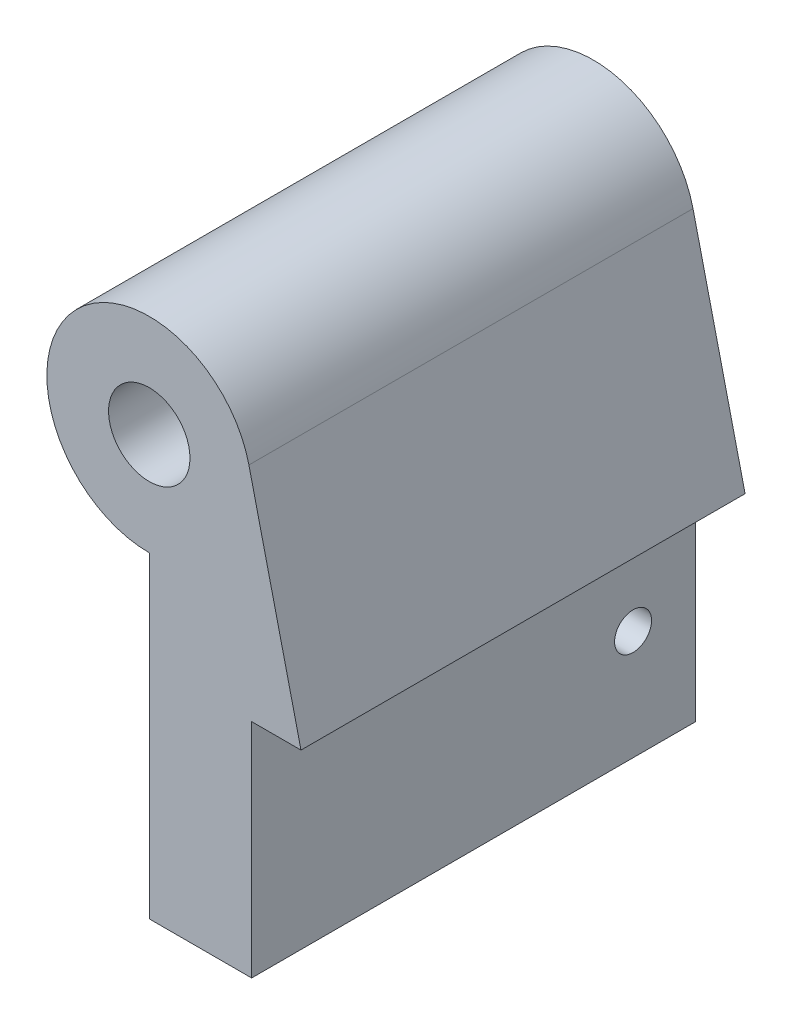
ISO-10303-21;
HEADER;
FILE_DESCRIPTION(('STEP AP214'),'2;1');
FILE_NAME('part.step','',(''),(''),'','','');
FILE_SCHEMA(('AUTOMOTIVE_DESIGN { 1 0 10303 214 1 1 1 1 }'));
ENDSEC;
DATA;
#1=APPLICATION_CONTEXT('core data for automotive mechanical design processes');
#2=APPLICATION_PROTOCOL_DEFINITION('international standard','automotive_design',2000,#1);
#3=PRODUCT_CONTEXT('',#1,'mechanical');
#4=PRODUCT('Part','Part','',(#3));
#5=PRODUCT_RELATED_PRODUCT_CATEGORY('part','',(#4));
#6=PRODUCT_DEFINITION_FORMATION('','',#4);
#7=PRODUCT_DEFINITION_CONTEXT('part definition',#1,'design');
#8=PRODUCT_DEFINITION('design','',#6,#7);
#9=PRODUCT_DEFINITION_SHAPE('','',#8);
#10=(LENGTH_UNIT() NAMED_UNIT(*) SI_UNIT(.MILLI.,.METRE.));
#11=(NAMED_UNIT(*) PLANE_ANGLE_UNIT() SI_UNIT($,.RADIAN.));
#12=(NAMED_UNIT(*) SI_UNIT($,.STERADIAN.) SOLID_ANGLE_UNIT());
#13=UNCERTAINTY_MEASURE_WITH_UNIT(LENGTH_MEASURE(1.E-05),#10,'distance_accuracy_value','');
#14=(GEOMETRIC_REPRESENTATION_CONTEXT(3) GLOBAL_UNCERTAINTY_ASSIGNED_CONTEXT((#13)) GLOBAL_UNIT_ASSIGNED_CONTEXT((#10,
#11,#12)) REPRESENTATION_CONTEXT('',''));
#15=CARTESIAN_POINT('',(0.,0.,0.));
#16=DIRECTION('',(0.,0.,1.));
#17=DIRECTION('',(1.,0.,0.));
#18=AXIS2_PLACEMENT_3D('',#15,#16,#17);
#19=CARTESIAN_POINT('',(0.,0.,9.));
#20=DIRECTION('',(0.,0.,1.));
#21=DIRECTION('',(1.,0.,0.));
#22=AXIS2_PLACEMENT_3D('',#19,#20,#21);
#23=PLANE('',#22);
#24=DIRECTION('',(1.,0.,0.));
#25=VECTOR('',#24,1.);
#26=CARTESIAN_POINT('',(4.15,-8.,9.));
#27=LINE('',#26,#25);
#28=CARTESIAN_POINT('',(4.15,-8.,9.));
#29=VERTEX_POINT('',#28);
#30=CARTESIAN_POINT('',(6.15,-8.,9.));
#31=VERTEX_POINT('',#30);
#32=EDGE_CURVE('E129',#29,#31,#27,.T.);
#33=ORIENTED_EDGE('',*,*,#32,.T.);
#34=DIRECTION('',(-0.229483943674819,0.973312447056675,0.));
#35=VECTOR('',#34,1.);
#36=CARTESIAN_POINT('',(6.15,-8.,9.));
#37=LINE('',#36,#35);
#38=CARTESIAN_POINT('',(4.0392466552852,0.952358366250499,9.));
#39=VERTEX_POINT('',#38);
#40=EDGE_CURVE('E87',#31,#39,#37,.T.);
#41=ORIENTED_EDGE('',*,*,#40,.T.);
#42=CARTESIAN_POINT('',(0.,0.,9.));
#43=DIRECTION('',(0.,0.,1.));
#44=DIRECTION('',(1.,0.,0.));
#45=AXIS2_PLACEMENT_3D('',#42,#43,#44);
#46=CIRCLE('',#45,4.15);
#47=CARTESIAN_POINT('',(0.,-4.15,9.));
#48=VERTEX_POINT('',#47);
#49=EDGE_CURVE('E100',#39,#48,#46,.T.);
#50=ORIENTED_EDGE('',*,*,#49,.T.);
#51=DIRECTION('',(0.,-1.,0.));
#52=VECTOR('',#51,1.);
#53=CARTESIAN_POINT('',(0.,-4.15,9.));
#54=LINE('',#53,#52);
#55=CARTESIAN_POINT('',(0.,-17.,9.));
#56=VERTEX_POINT('',#55);
#57=EDGE_CURVE('E94',#48,#56,#54,.T.);
#58=ORIENTED_EDGE('',*,*,#57,.T.);
#59=DIRECTION('',(1.,0.,0.));
#60=VECTOR('',#59,1.);
#61=CARTESIAN_POINT('',(0.,-17.,9.));
#62=LINE('',#61,#60);
#63=CARTESIAN_POINT('',(4.15,-17.,9.));
#64=VERTEX_POINT('',#63);
#65=EDGE_CURVE('E98',#56,#64,#62,.T.);
#66=ORIENTED_EDGE('',*,*,#65,.T.);
#67=DIRECTION('',(0.,1.,0.));
#68=VECTOR('',#67,1.);
#69=CARTESIAN_POINT('',(4.15,-17.,9.));
#70=LINE('',#69,#68);
#71=EDGE_CURVE('E50',#64,#29,#70,.T.);
#72=ORIENTED_EDGE('',*,*,#71,.T.);
#73=EDGE_LOOP('',(#33,#41,#50,#58,#66,#72));
#74=FACE_BOUND('',#73,.T.);
#75=CARTESIAN_POINT('',(0.,0.,9.));
#76=DIRECTION('',(0.,0.,1.));
#77=DIRECTION('',(1.,0.,0.));
#78=AXIS2_PLACEMENT_3D('',#75,#76,#77);
#79=CIRCLE('',#78,1.65);
#80=CARTESIAN_POINT('',(1.65,0.,9.));
#81=VERTEX_POINT('',#80);
#82=EDGE_CURVE('E122',#81,#81,#79,.T.);
#83=ORIENTED_EDGE('',*,*,#82,.F.);
#84=EDGE_LOOP('',(#83));
#85=FACE_BOUND('',#84,.T.);
#86=ADVANCED_FACE('F33',(#74,#85),#23,.T.);
#87=CARTESIAN_POINT('',(0.,0.,-9.));
#88=DIRECTION('',(0.,0.,1.));
#89=DIRECTION('',(1.,0.,0.));
#90=AXIS2_PLACEMENT_3D('',#87,#88,#89);
#91=PLANE('',#90);
#92=DIRECTION('',(1.,0.,0.));
#93=VECTOR('',#92,1.);
#94=CARTESIAN_POINT('',(4.15,-8.,-9.));
#95=LINE('',#94,#93);
#96=CARTESIAN_POINT('',(4.15,-8.,-9.));
#97=VERTEX_POINT('',#96);
#98=CARTESIAN_POINT('',(6.15,-8.,-9.));
#99=VERTEX_POINT('',#98);
#100=EDGE_CURVE('E118',#97,#99,#95,.T.);
#101=ORIENTED_EDGE('',*,*,#100,.F.);
#102=DIRECTION('',(0.,1.,0.));
#103=VECTOR('',#102,1.);
#104=CARTESIAN_POINT('',(4.15,-17.,-9.));
#105=LINE('',#104,#103);
#106=CARTESIAN_POINT('',(4.15,-17.,-9.));
#107=VERTEX_POINT('',#106);
#108=EDGE_CURVE('E79',#107,#97,#105,.T.);
#109=ORIENTED_EDGE('',*,*,#108,.F.);
#110=DIRECTION('',(1.,0.,0.));
#111=VECTOR('',#110,1.);
#112=CARTESIAN_POINT('',(0.,-17.,-9.));
#113=LINE('',#112,#111);
#114=CARTESIAN_POINT('',(0.,-17.,-9.));
#115=VERTEX_POINT('',#114);
#116=EDGE_CURVE('E73',#115,#107,#113,.T.);
#117=ORIENTED_EDGE('',*,*,#116,.F.);
#118=DIRECTION('',(0.,-1.,0.));
#119=VECTOR('',#118,1.);
#120=CARTESIAN_POINT('',(0.,-4.15,-9.));
#121=LINE('',#120,#119);
#122=CARTESIAN_POINT('',(0.,-4.15,-9.));
#123=VERTEX_POINT('',#122);
#124=EDGE_CURVE('E108',#123,#115,#121,.T.);
#125=ORIENTED_EDGE('',*,*,#124,.F.);
#126=CARTESIAN_POINT('',(0.,0.,-9.));
#127=DIRECTION('',(0.,0.,1.));
#128=DIRECTION('',(1.,0.,0.));
#129=AXIS2_PLACEMENT_3D('',#126,#127,#128);
#130=CIRCLE('',#129,4.15);
#131=CARTESIAN_POINT('',(4.0392466552852,0.952358366250499,-9.));
#132=VERTEX_POINT('',#131);
#133=EDGE_CURVE('E124',#132,#123,#130,.T.);
#134=ORIENTED_EDGE('',*,*,#133,.F.);
#135=DIRECTION('',(-0.229483943674819,0.973312447056675,0.));
#136=VECTOR('',#135,1.);
#137=CARTESIAN_POINT('',(6.15,-8.,-9.));
#138=LINE('',#137,#136);
#139=EDGE_CURVE('E121',#99,#132,#138,.T.);
#140=ORIENTED_EDGE('',*,*,#139,.F.);
#141=EDGE_LOOP('',(#101,#109,#117,#125,#134,#140));
#142=FACE_BOUND('',#141,.T.);
#143=CARTESIAN_POINT('',(0.,0.,-9.));
#144=DIRECTION('',(0.,0.,1.));
#145=DIRECTION('',(1.,0.,0.));
#146=AXIS2_PLACEMENT_3D('',#143,#144,#145);
#147=CIRCLE('',#146,1.65);
#148=CARTESIAN_POINT('',(1.65,0.,-9.));
#149=VERTEX_POINT('',#148);
#150=EDGE_CURVE('E175',#149,#149,#147,.T.);
#151=ORIENTED_EDGE('',*,*,#150,.T.);
#152=EDGE_LOOP('',(#151));
#153=FACE_BOUND('',#152,.T.);
#154=ADVANCED_FACE('F138',(#142,#153),#91,.F.);
#155=CARTESIAN_POINT('',(4.15,-8.,9.));
#156=DIRECTION('',(0.,1.,0.));
#157=DIRECTION('',(0.,0.,1.));
#158=AXIS2_PLACEMENT_3D('',#155,#156,#157);
#159=PLANE('',#158);
#160=ORIENTED_EDGE('',*,*,#100,.T.);
#161=DIRECTION('',(0.,0.,-1.));
#162=VECTOR('',#161,1.);
#163=CARTESIAN_POINT('',(6.15,-8.,9.));
#164=LINE('',#163,#162);
#165=EDGE_CURVE('E11',#31,#99,#164,.T.);
#166=ORIENTED_EDGE('',*,*,#165,.F.);
#167=ORIENTED_EDGE('',*,*,#32,.F.);
#168=DIRECTION('',(0.,0.,-1.));
#169=VECTOR('',#168,1.);
#170=CARTESIAN_POINT('',(4.15,-8.,9.));
#171=LINE('',#170,#169);
#172=EDGE_CURVE('E114',#29,#97,#171,.T.);
#173=ORIENTED_EDGE('',*,*,#172,.T.);
#174=EDGE_LOOP('',(#160,#166,#167,#173));
#175=FACE_BOUND('',#174,.T.);
#176=ADVANCED_FACE('F35',(#175),#159,.F.);
#177=CARTESIAN_POINT('',(6.15,-8.,9.));
#178=DIRECTION('',(-0.973312447056675,-0.229483943674819,0.));
#179=DIRECTION('',(0.229483943674819,-0.973312447056675,0.));
#180=AXIS2_PLACEMENT_3D('',#177,#178,#179);
#181=PLANE('',#180);
#182=ORIENTED_EDGE('',*,*,#139,.T.);
#183=DIRECTION('',(0.,0.,-1.));
#184=VECTOR('',#183,1.);
#185=CARTESIAN_POINT('',(4.0392466552852,0.952358366250499,9.));
#186=LINE('',#185,#184);
#187=EDGE_CURVE('E42',#39,#132,#186,.T.);
#188=ORIENTED_EDGE('',*,*,#187,.F.);
#189=ORIENTED_EDGE('',*,*,#40,.F.);
#190=ORIENTED_EDGE('',*,*,#165,.T.);
#191=EDGE_LOOP('',(#182,#188,#189,#190));
#192=FACE_BOUND('',#191,.T.);
#193=ADVANCED_FACE('F192',(#192),#181,.F.);
#194=CARTESIAN_POINT('',(0.,0.,9.));
#195=DIRECTION('',(0.,0.,-1.));
#196=DIRECTION('',(-1.,0.,0.));
#197=AXIS2_PLACEMENT_3D('',#194,#195,#196);
#198=CYLINDRICAL_SURFACE('',#197,4.15);
#199=ORIENTED_EDGE('',*,*,#133,.T.);
#200=DIRECTION('',(0.,0.,-1.));
#201=VECTOR('',#200,1.);
#202=CARTESIAN_POINT('',(0.,-4.15,9.));
#203=LINE('',#202,#201);
#204=EDGE_CURVE('E109',#48,#123,#203,.T.);
#205=ORIENTED_EDGE('',*,*,#204,.F.);
#206=ORIENTED_EDGE('',*,*,#49,.F.);
#207=ORIENTED_EDGE('',*,*,#187,.T.);
#208=EDGE_LOOP('',(#199,#205,#206,#207));
#209=FACE_BOUND('',#208,.T.);
#210=ADVANCED_FACE('F135',(#209),#198,.T.);
#211=CARTESIAN_POINT('',(0.,-4.15,9.));
#212=DIRECTION('',(1.,0.,0.));
#213=DIRECTION('',(0.,1.,0.));
#214=AXIS2_PLACEMENT_3D('',#211,#212,#213);
#215=PLANE('',#214);
#216=CARTESIAN_POINT('',(0.,-12.5550000000001,-6.46));
#217=DIRECTION('',(1.,0.,0.));
#218=DIRECTION('',(0.,1.,0.));
#219=AXIS2_PLACEMENT_3D('',#216,#217,#218);
#220=CIRCLE('',#219,0.750000000000001);
#221=CARTESIAN_POINT('',(0.,-11.8050000000001,-6.46));
#222=VERTEX_POINT('',#221);
#223=EDGE_CURVE('E173',#222,#222,#220,.T.);
#224=ORIENTED_EDGE('',*,*,#223,.T.);
#225=EDGE_LOOP('',(#224));
#226=FACE_BOUND('',#225,.T.);
#227=ORIENTED_EDGE('',*,*,#124,.T.);
#228=DIRECTION('',(0.,0.,-1.));
#229=VECTOR('',#228,1.);
#230=CARTESIAN_POINT('',(0.,-17.,9.));
#231=LINE('',#230,#229);
#232=EDGE_CURVE('E105',#56,#115,#231,.T.);
#233=ORIENTED_EDGE('',*,*,#232,.F.);
#234=ORIENTED_EDGE('',*,*,#57,.F.);
#235=ORIENTED_EDGE('',*,*,#204,.T.);
#236=EDGE_LOOP('',(#227,#233,#234,#235));
#237=FACE_BOUND('',#236,.T.);
#238=ADVANCED_FACE('F106',(#226,#237),#215,.F.);
#239=CARTESIAN_POINT('',(0.,-17.,9.));
#240=DIRECTION('',(0.,1.,0.));
#241=DIRECTION('',(0.,0.,1.));
#242=AXIS2_PLACEMENT_3D('',#239,#240,#241);
#243=PLANE('',#242);
#244=ORIENTED_EDGE('',*,*,#116,.T.);
#245=DIRECTION('',(0.,0.,-1.));
#246=VECTOR('',#245,1.);
#247=CARTESIAN_POINT('',(4.15,-17.,9.));
#248=LINE('',#247,#246);
#249=EDGE_CURVE('E110',#64,#107,#248,.T.);
#250=ORIENTED_EDGE('',*,*,#249,.F.);
#251=ORIENTED_EDGE('',*,*,#65,.F.);
#252=ORIENTED_EDGE('',*,*,#232,.T.);
#253=EDGE_LOOP('',(#244,#250,#251,#252));
#254=FACE_BOUND('',#253,.T.);
#255=ADVANCED_FACE('F112',(#254),#243,.F.);
#256=CARTESIAN_POINT('',(4.15,-17.,9.));
#257=DIRECTION('',(-1.,0.,0.));
#258=DIRECTION('',(0.,0.,1.));
#259=AXIS2_PLACEMENT_3D('',#256,#257,#258);
#260=PLANE('',#259);
#261=CARTESIAN_POINT('',(4.15,-12.5550000000001,-6.46));
#262=DIRECTION('',(1.,0.,0.));
#263=DIRECTION('',(0.,0.,-1.));
#264=AXIS2_PLACEMENT_3D('',#261,#262,#263);
#265=CIRCLE('',#264,0.750000000000001);
#266=CARTESIAN_POINT('',(4.15,-12.5550000000001,-7.21));
#267=VERTEX_POINT('',#266);
#268=EDGE_CURVE('E170',#267,#267,#265,.T.);
#269=ORIENTED_EDGE('',*,*,#268,.F.);
#270=EDGE_LOOP('',(#269));
#271=FACE_BOUND('',#270,.T.);
#272=ORIENTED_EDGE('',*,*,#108,.T.);
#273=ORIENTED_EDGE('',*,*,#172,.F.);
#274=ORIENTED_EDGE('',*,*,#71,.F.);
#275=ORIENTED_EDGE('',*,*,#249,.T.);
#276=EDGE_LOOP('',(#272,#273,#274,#275));
#277=FACE_BOUND('',#276,.T.);
#278=ADVANCED_FACE('F143',(#271,#277),#260,.F.);
#279=CARTESIAN_POINT('',(0.,0.,9.));
#280=DIRECTION('',(0.,0.,-1.));
#281=DIRECTION('',(-1.,0.,0.));
#282=AXIS2_PLACEMENT_3D('',#279,#280,#281);
#283=CYLINDRICAL_SURFACE('',#282,1.65);
#284=ORIENTED_EDGE('',*,*,#82,.T.);
#285=EDGE_LOOP('',(#284));
#286=FACE_BOUND('',#285,.T.);
#287=ORIENTED_EDGE('',*,*,#150,.F.);
#288=EDGE_LOOP('',(#287));
#289=FACE_BOUND('',#288,.T.);
#290=ADVANCED_FACE('F145',(#286,#289),#283,.F.);
#291=CARTESIAN_POINT('',(-4.15,-12.5550000000001,-6.46));
#292=DIRECTION('',(1.,0.,0.));
#293=DIRECTION('',(0.,0.,-1.));
#294=AXIS2_PLACEMENT_3D('',#291,#292,#293);
#295=CYLINDRICAL_SURFACE('',#294,0.750000000000001);
#296=ORIENTED_EDGE('',*,*,#268,.T.);
#297=EDGE_LOOP('',(#296));
#298=FACE_BOUND('',#297,.T.);
#299=ORIENTED_EDGE('',*,*,#223,.F.);
#300=EDGE_LOOP('',(#299));
#301=FACE_BOUND('',#300,.T.);
#302=ADVANCED_FACE('F152',(#298,#301),#295,.F.);
#303=CLOSED_SHELL('',(#86,#154,#176,#193,#210,#238,#255,#278,#290,#302));
#304=MANIFOLD_SOLID_BREP('B2',#303);
#305=ADVANCED_BREP_SHAPE_REPRESENTATION('',(#18,#304),#14);
#306=SHAPE_DEFINITION_REPRESENTATION(#9,#305);
ENDSEC;
END-ISO-10303-21;
